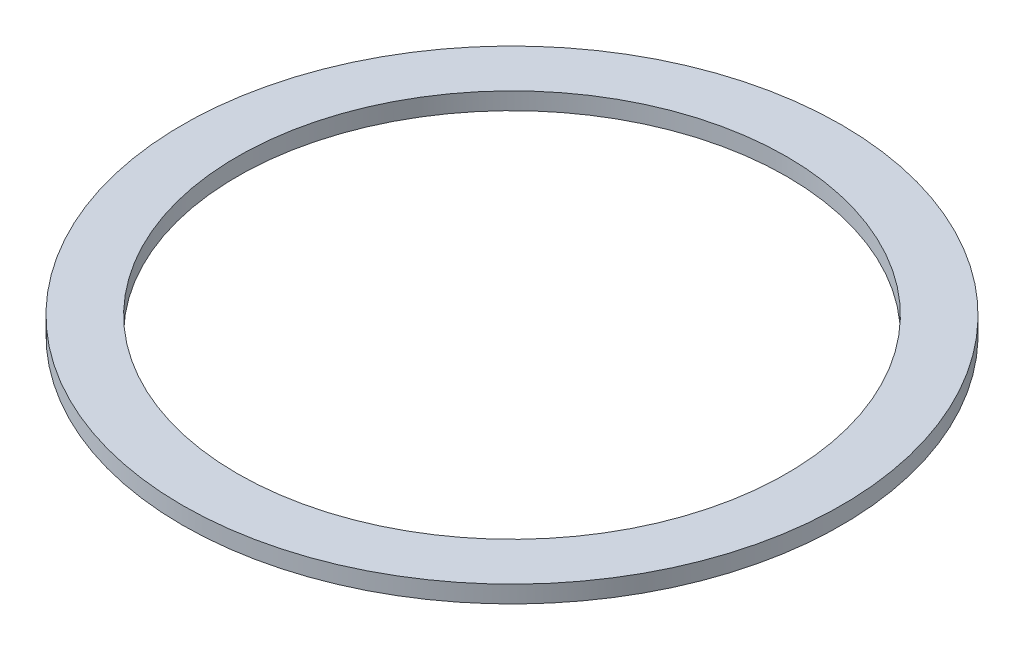
ISO-10303-21;
HEADER;
FILE_DESCRIPTION(('STEP AP214'),'2;1');
FILE_NAME('part.step','',(''),(''),'','','');
FILE_SCHEMA(('AUTOMOTIVE_DESIGN { 1 0 10303 214 1 1 1 1 }'));
ENDSEC;
DATA;
#1=APPLICATION_CONTEXT('core data for automotive mechanical design processes');
#2=APPLICATION_PROTOCOL_DEFINITION('international standard','automotive_design',2000,#1);
#3=PRODUCT_CONTEXT('',#1,'mechanical');
#4=PRODUCT('Part','Part','',(#3));
#5=PRODUCT_RELATED_PRODUCT_CATEGORY('part','',(#4));
#6=PRODUCT_DEFINITION_FORMATION('','',#4);
#7=PRODUCT_DEFINITION_CONTEXT('part definition',#1,'design');
#8=PRODUCT_DEFINITION('design','',#6,#7);
#9=PRODUCT_DEFINITION_SHAPE('','',#8);
#10=(LENGTH_UNIT() NAMED_UNIT(*) SI_UNIT(.MILLI.,.METRE.));
#11=(NAMED_UNIT(*) PLANE_ANGLE_UNIT() SI_UNIT($,.RADIAN.));
#12=(NAMED_UNIT(*) SI_UNIT($,.STERADIAN.) SOLID_ANGLE_UNIT());
#13=UNCERTAINTY_MEASURE_WITH_UNIT(LENGTH_MEASURE(1.E-05),#10,'distance_accuracy_value','');
#14=(GEOMETRIC_REPRESENTATION_CONTEXT(3) GLOBAL_UNCERTAINTY_ASSIGNED_CONTEXT((#13)) GLOBAL_UNIT_ASSIGNED_CONTEXT((#10,
#11,#12)) REPRESENTATION_CONTEXT('',''));
#15=CARTESIAN_POINT('',(0.,0.,0.));
#16=DIRECTION('',(0.,0.,1.));
#17=DIRECTION('',(1.,0.,0.));
#18=AXIS2_PLACEMENT_3D('',#15,#16,#17);
#19=CARTESIAN_POINT('',(0.,5.,0.));
#20=DIRECTION('',(0.,1.,0.));
#21=DIRECTION('',(0.,0.,1.));
#22=AXIS2_PLACEMENT_3D('',#19,#20,#21);
#23=PLANE('',#22);
#24=CARTESIAN_POINT('',(0.,5.,0.));
#25=DIRECTION('',(0.,1.,0.));
#26=DIRECTION('',(0.,0.,1.));
#27=AXIS2_PLACEMENT_3D('',#24,#25,#26);
#28=CIRCLE('',#27,96.);
#29=CARTESIAN_POINT('',(0.,5.,96.));
#30=VERTEX_POINT('',#29);
#31=EDGE_CURVE('E10',#30,#30,#28,.T.);
#32=ORIENTED_EDGE('',*,*,#31,.T.);
#33=EDGE_LOOP('',(#32));
#34=FACE_BOUND('',#33,.T.);
#35=CARTESIAN_POINT('',(0.,5.,0.));
#36=DIRECTION('',(0.,1.,0.));
#37=DIRECTION('',(0.,0.,1.));
#38=AXIS2_PLACEMENT_3D('',#35,#36,#37);
#39=CIRCLE('',#38,80.);
#40=CARTESIAN_POINT('',(0.,5.,80.));
#41=VERTEX_POINT('',#40);
#42=EDGE_CURVE('E50',#41,#41,#39,.T.);
#43=ORIENTED_EDGE('',*,*,#42,.F.);
#44=EDGE_LOOP('',(#43));
#45=FACE_BOUND('',#44,.T.);
#46=ADVANCED_FACE('F37',(#34,#45),#23,.T.);
#47=CARTESIAN_POINT('',(0.,0.,0.));
#48=DIRECTION('',(0.,1.,0.));
#49=DIRECTION('',(0.,0.,1.));
#50=AXIS2_PLACEMENT_3D('',#47,#48,#49);
#51=PLANE('',#50);
#52=CARTESIAN_POINT('',(0.,0.,0.));
#53=DIRECTION('',(0.,1.,0.));
#54=DIRECTION('',(0.,0.,1.));
#55=AXIS2_PLACEMENT_3D('',#52,#53,#54);
#56=CIRCLE('',#55,96.);
#57=CARTESIAN_POINT('',(0.,0.,96.));
#58=VERTEX_POINT('',#57);
#59=EDGE_CURVE('E41',#58,#58,#56,.T.);
#60=ORIENTED_EDGE('',*,*,#59,.F.);
#61=EDGE_LOOP('',(#60));
#62=FACE_BOUND('',#61,.T.);
#63=CARTESIAN_POINT('',(0.,0.,0.));
#64=DIRECTION('',(0.,1.,0.));
#65=DIRECTION('',(0.,0.,1.));
#66=AXIS2_PLACEMENT_3D('',#63,#64,#65);
#67=CIRCLE('',#66,80.);
#68=CARTESIAN_POINT('',(0.,0.,80.));
#69=VERTEX_POINT('',#68);
#70=EDGE_CURVE('E52',#69,#69,#67,.T.);
#71=ORIENTED_EDGE('',*,*,#70,.T.);
#72=EDGE_LOOP('',(#71));
#73=FACE_BOUND('',#72,.T.);
#74=ADVANCED_FACE('F64',(#62,#73),#51,.F.);
#75=CARTESIAN_POINT('',(0.,5.,0.));
#76=DIRECTION('',(0.,-1.,0.));
#77=DIRECTION('',(0.,0.,-1.));
#78=AXIS2_PLACEMENT_3D('',#75,#76,#77);
#79=CYLINDRICAL_SURFACE('',#78,96.);
#80=ORIENTED_EDGE('',*,*,#31,.F.);
#81=EDGE_LOOP('',(#80));
#82=FACE_BOUND('',#81,.T.);
#83=ORIENTED_EDGE('',*,*,#59,.T.);
#84=EDGE_LOOP('',(#83));
#85=FACE_BOUND('',#84,.T.);
#86=ADVANCED_FACE('F39',(#82,#85),#79,.T.);
#87=CARTESIAN_POINT('',(0.,5.,0.));
#88=DIRECTION('',(0.,-1.,0.));
#89=DIRECTION('',(0.,0.,-1.));
#90=AXIS2_PLACEMENT_3D('',#87,#88,#89);
#91=CYLINDRICAL_SURFACE('',#90,80.);
#92=ORIENTED_EDGE('',*,*,#42,.T.);
#93=EDGE_LOOP('',(#92));
#94=FACE_BOUND('',#93,.T.);
#95=ORIENTED_EDGE('',*,*,#70,.F.);
#96=EDGE_LOOP('',(#95));
#97=FACE_BOUND('',#96,.T.);
#98=ADVANCED_FACE('F60',(#94,#97),#91,.F.);
#99=CLOSED_SHELL('',(#46,#74,#86,#98));
#100=MANIFOLD_SOLID_BREP('B2',#99);
#101=ADVANCED_BREP_SHAPE_REPRESENTATION('',(#18,#100),#14);
#102=SHAPE_DEFINITION_REPRESENTATION(#9,#101);
ENDSEC;
END-ISO-10303-21;
